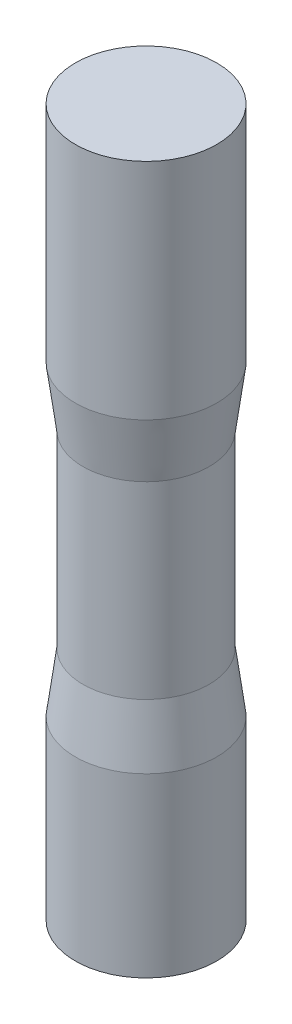
ISO-10303-21;
HEADER;
FILE_DESCRIPTION(('STEP AP214'),'2;1');
FILE_NAME('part.step','',(''),(''),'','','');
FILE_SCHEMA(('AUTOMOTIVE_DESIGN { 1 0 10303 214 1 1 1 1 }'));
ENDSEC;
DATA;
#1=APPLICATION_CONTEXT('core data for automotive mechanical design processes');
#2=APPLICATION_PROTOCOL_DEFINITION('international standard','automotive_design',2000,#1);
#3=PRODUCT_CONTEXT('',#1,'mechanical');
#4=PRODUCT('Part','Part','',(#3));
#5=PRODUCT_RELATED_PRODUCT_CATEGORY('part','',(#4));
#6=PRODUCT_DEFINITION_FORMATION('','',#4);
#7=PRODUCT_DEFINITION_CONTEXT('part definition',#1,'design');
#8=PRODUCT_DEFINITION('design','',#6,#7);
#9=PRODUCT_DEFINITION_SHAPE('','',#8);
#10=(LENGTH_UNIT() NAMED_UNIT(*) SI_UNIT(.MILLI.,.METRE.));
#11=(NAMED_UNIT(*) PLANE_ANGLE_UNIT() SI_UNIT($,.RADIAN.));
#12=(NAMED_UNIT(*) SI_UNIT($,.STERADIAN.) SOLID_ANGLE_UNIT());
#13=UNCERTAINTY_MEASURE_WITH_UNIT(LENGTH_MEASURE(1.E-05),#10,'distance_accuracy_value','');
#14=(GEOMETRIC_REPRESENTATION_CONTEXT(3) GLOBAL_UNCERTAINTY_ASSIGNED_CONTEXT((#13)) GLOBAL_UNIT_ASSIGNED_CONTEXT((#10,
#11,#12)) REPRESENTATION_CONTEXT('',''));
#15=CARTESIAN_POINT('',(0.,0.,0.));
#16=DIRECTION('',(0.,0.,1.));
#17=DIRECTION('',(1.,0.,0.));
#18=AXIS2_PLACEMENT_3D('',#15,#16,#17);
#19=CARTESIAN_POINT('',(0.,0.,0.));
#20=DIRECTION('',(0.,-1.,0.));
#21=DIRECTION('',(0.,0.,-1.));
#22=AXIS2_PLACEMENT_3D('',#19,#20,#21);
#23=PLANE('',#22);
#24=CARTESIAN_POINT('',(0.,0.,0.));
#25=DIRECTION('',(0.,-1.,0.));
#26=DIRECTION('',(0.,0.,-1.));
#27=AXIS2_PLACEMENT_3D('',#24,#25,#26);
#28=CIRCLE('',#27,3.);
#29=CARTESIAN_POINT('',(0.,0.,-3.));
#30=VERTEX_POINT('',#29);
#31=EDGE_CURVE('E10',#30,#30,#28,.T.);
#32=ORIENTED_EDGE('',*,*,#31,.F.);
#33=EDGE_LOOP('',(#32));
#34=FACE_BOUND('',#33,.T.);
#35=ADVANCED_FACE('F37',(#34),#23,.F.);
#36=CARTESIAN_POINT('',(0.,-30.,0.));
#37=DIRECTION('',(0.,-1.,0.));
#38=DIRECTION('',(0.,0.,-1.));
#39=AXIS2_PLACEMENT_3D('',#36,#37,#38);
#40=CYLINDRICAL_SURFACE('',#39,3.);
#41=CARTESIAN_POINT('',(0.,-9.5,0.));
#42=DIRECTION('',(0.,-1.,0.));
#43=DIRECTION('',(0.,0.,-1.));
#44=AXIS2_PLACEMENT_3D('',#41,#42,#43);
#45=CIRCLE('',#44,3.);
#46=CARTESIAN_POINT('',(0.,-9.5,-3.));
#47=VERTEX_POINT('',#46);
#48=EDGE_CURVE('E43',#47,#47,#45,.T.);
#49=ORIENTED_EDGE('',*,*,#48,.F.);
#50=EDGE_LOOP('',(#49));
#51=FACE_BOUND('',#50,.T.);
#52=ORIENTED_EDGE('',*,*,#31,.T.);
#53=EDGE_LOOP('',(#52));
#54=FACE_BOUND('',#53,.T.);
#55=ADVANCED_FACE('F85',(#51,#54),#40,.T.);
#56=CARTESIAN_POINT('',(0.,-9.5,0.));
#57=DIRECTION('',(0.,1.,0.));
#58=DIRECTION('',(0.,0.,1.));
#59=AXIS2_PLACEMENT_3D('',#56,#57,#58);
#60=CONICAL_SURFACE('',#59,3.,0.129275004048144);
#61=CARTESIAN_POINT('',(0.,-12.,0.));
#62=DIRECTION('',(0.,-1.,0.));
#63=DIRECTION('',(0.,0.,-1.));
#64=AXIS2_PLACEMENT_3D('',#61,#62,#63);
#65=CIRCLE('',#64,2.675);
#66=CARTESIAN_POINT('',(0.,-12.,-2.675));
#67=VERTEX_POINT('',#66);
#68=EDGE_CURVE('E47',#67,#67,#65,.T.);
#69=ORIENTED_EDGE('',*,*,#68,.F.);
#70=EDGE_LOOP('',(#69));
#71=FACE_BOUND('',#70,.T.);
#72=ORIENTED_EDGE('',*,*,#48,.T.);
#73=EDGE_LOOP('',(#72));
#74=FACE_BOUND('',#73,.T.);
#75=ADVANCED_FACE('F80',(#71,#74),#60,.T.);
#76=CARTESIAN_POINT('',(0.,-30.,0.));
#77=DIRECTION('',(0.,-1.,0.));
#78=DIRECTION('',(0.,0.,-1.));
#79=AXIS2_PLACEMENT_3D('',#76,#77,#78);
#80=CYLINDRICAL_SURFACE('',#79,2.675);
#81=CARTESIAN_POINT('',(0.,-20.,0.));
#82=DIRECTION('',(0.,-1.,0.));
#83=DIRECTION('',(0.,0.,-1.));
#84=AXIS2_PLACEMENT_3D('',#81,#82,#83);
#85=CIRCLE('',#84,2.675);
#86=CARTESIAN_POINT('',(0.,-20.,-2.675));
#87=VERTEX_POINT('',#86);
#88=EDGE_CURVE('E51',#87,#87,#85,.T.);
#89=ORIENTED_EDGE('',*,*,#88,.F.);
#90=EDGE_LOOP('',(#89));
#91=FACE_BOUND('',#90,.T.);
#92=ORIENTED_EDGE('',*,*,#68,.T.);
#93=EDGE_LOOP('',(#92));
#94=FACE_BOUND('',#93,.T.);
#95=ADVANCED_FACE('F74',(#91,#94),#80,.T.);
#96=CARTESIAN_POINT('',(0.,-20.,0.));
#97=DIRECTION('',(0.,-1.,0.));
#98=DIRECTION('',(0.,0.,-1.));
#99=AXIS2_PLACEMENT_3D('',#96,#97,#98);
#100=CONICAL_SURFACE('',#99,2.675,0.129275004048144);
#101=CARTESIAN_POINT('',(0.,-22.5,0.));
#102=DIRECTION('',(0.,-1.,0.));
#103=DIRECTION('',(0.,0.,-1.));
#104=AXIS2_PLACEMENT_3D('',#101,#102,#103);
#105=CIRCLE('',#104,3.);
#106=CARTESIAN_POINT('',(0.,-22.5,-3.));
#107=VERTEX_POINT('',#106);
#108=EDGE_CURVE('E56',#107,#107,#105,.T.);
#109=ORIENTED_EDGE('',*,*,#108,.F.);
#110=EDGE_LOOP('',(#109));
#111=FACE_BOUND('',#110,.T.);
#112=ORIENTED_EDGE('',*,*,#88,.T.);
#113=EDGE_LOOP('',(#112));
#114=FACE_BOUND('',#113,.T.);
#115=ADVANCED_FACE('F68',(#111,#114),#100,.T.);
#116=CARTESIAN_POINT('',(0.,-30.,0.));
#117=DIRECTION('',(0.,-1.,0.));
#118=DIRECTION('',(0.,0.,-1.));
#119=AXIS2_PLACEMENT_3D('',#116,#117,#118);
#120=CYLINDRICAL_SURFACE('',#119,3.);
#121=CARTESIAN_POINT('',(0.,-30.,0.));
#122=DIRECTION('',(0.,-1.,0.));
#123=DIRECTION('',(0.,0.,-1.));
#124=AXIS2_PLACEMENT_3D('',#121,#122,#123);
#125=CIRCLE('',#124,3.);
#126=CARTESIAN_POINT('',(0.,-30.,-3.));
#127=VERTEX_POINT('',#126);
#128=EDGE_CURVE('E59',#127,#127,#125,.T.);
#129=ORIENTED_EDGE('',*,*,#128,.F.);
#130=EDGE_LOOP('',(#129));
#131=FACE_BOUND('',#130,.T.);
#132=ORIENTED_EDGE('',*,*,#108,.T.);
#133=EDGE_LOOP('',(#132));
#134=FACE_BOUND('',#133,.T.);
#135=ADVANCED_FACE('F65',(#131,#134),#120,.T.);
#136=CARTESIAN_POINT('',(-3.,-30.,0.));
#137=DIRECTION('',(0.,1.,0.));
#138=DIRECTION('',(0.,0.,1.));
#139=AXIS2_PLACEMENT_3D('',#136,#137,#138);
#140=PLANE('',#139);
#141=ORIENTED_EDGE('',*,*,#128,.T.);
#142=EDGE_LOOP('',(#141));
#143=FACE_BOUND('',#142,.T.);
#144=ADVANCED_FACE('F63',(#143),#140,.F.);
#145=CLOSED_SHELL('',(#35,#55,#75,#95,#115,#135,#144));
#146=MANIFOLD_SOLID_BREP('B2',#145);
#147=ADVANCED_BREP_SHAPE_REPRESENTATION('',(#18,#146),#14);
#148=SHAPE_DEFINITION_REPRESENTATION(#9,#147);
ENDSEC;
END-ISO-10303-21;
